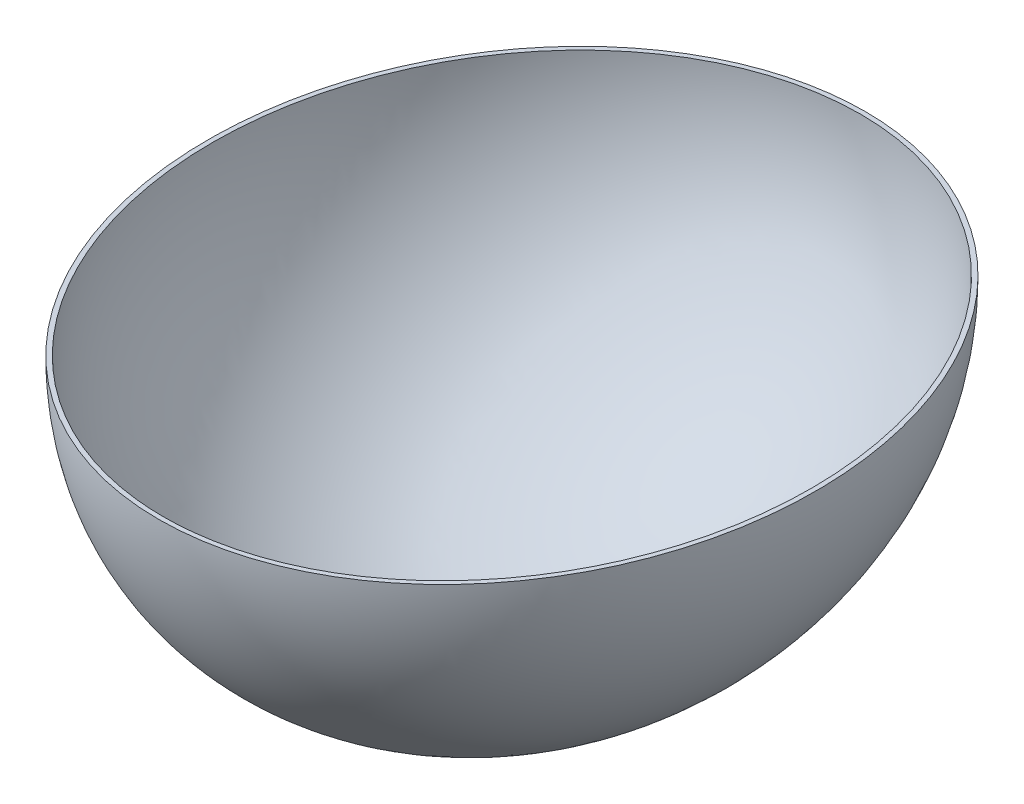
ISO-10303-21;
HEADER;
FILE_DESCRIPTION(('STEP AP214'),'2;1');
FILE_NAME('part.step','',(''),(''),'','','');
FILE_SCHEMA(('AUTOMOTIVE_DESIGN { 1 0 10303 214 1 1 1 1 }'));
ENDSEC;
DATA;
#1=APPLICATION_CONTEXT('core data for automotive mechanical design processes');
#2=APPLICATION_PROTOCOL_DEFINITION('international standard','automotive_design',2000,#1);
#3=PRODUCT_CONTEXT('',#1,'mechanical');
#4=PRODUCT('Part','Part','',(#3));
#5=PRODUCT_RELATED_PRODUCT_CATEGORY('part','',(#4));
#6=PRODUCT_DEFINITION_FORMATION('','',#4);
#7=PRODUCT_DEFINITION_CONTEXT('part definition',#1,'design');
#8=PRODUCT_DEFINITION('design','',#6,#7);
#9=PRODUCT_DEFINITION_SHAPE('','',#8);
#10=(LENGTH_UNIT() NAMED_UNIT(*) SI_UNIT(.MILLI.,.METRE.));
#11=(NAMED_UNIT(*) PLANE_ANGLE_UNIT() SI_UNIT($,.RADIAN.));
#12=(NAMED_UNIT(*) SI_UNIT($,.STERADIAN.) SOLID_ANGLE_UNIT());
#13=UNCERTAINTY_MEASURE_WITH_UNIT(LENGTH_MEASURE(1.E-05),#10,'distance_accuracy_value','');
#14=(GEOMETRIC_REPRESENTATION_CONTEXT(3) GLOBAL_UNCERTAINTY_ASSIGNED_CONTEXT((#13)) GLOBAL_UNIT_ASSIGNED_CONTEXT((#10,
#11,#12)) REPRESENTATION_CONTEXT('',''));
#15=CARTESIAN_POINT('',(0.,0.,0.));
#16=DIRECTION('',(0.,0.,1.));
#17=DIRECTION('',(1.,0.,0.));
#18=AXIS2_PLACEMENT_3D('',#15,#16,#17);
#19=CARTESIAN_POINT('',(0.,0.,0.));
#20=DIRECTION('',(0.,-1.,0.));
#21=DIRECTION('',(0.,0.,-1.));
#22=AXIS2_PLACEMENT_3D('',#19,#20,#21);
#23=ELLIPSE('',#22,230.,198.);
#24=TRIMMED_CURVE('',#23,(PARAMETER_VALUE(3.14159265358979)),
(PARAMETER_VALUE(6.28318530717959)),.T.,.PARAMETER.);
#25=CARTESIAN_POINT('',(0.,0.,0.));
#26=DIRECTION('',(0.,0.,1.));
#27=AXIS1_PLACEMENT('',#25,#26);
#28=SURFACE_OF_REVOLUTION('',#24,#27);
#29=CARTESIAN_POINT('',(0.,0.,0.));
#30=DIRECTION('',(0.,1.,0.));
#31=DIRECTION('',(0.,0.,-1.));
#32=AXIS2_PLACEMENT_3D('',#29,#30,#31);
#33=ELLIPSE('',#32,230.,198.);
#34=CARTESIAN_POINT('',(0.,0.,229.99999999999));
#35=VERTEX_POINT('',#34);
#36=CARTESIAN_POINT('',(0.,0.,-229.99999999999));
#37=VERTEX_POINT('',#36);
#38=EDGE_CURVE('E50',#35,#37,#33,.T.);
#39=ORIENTED_EDGE('',*,*,#38,.F.);
#40=EDGE_CURVE('E44',#35,#37,#23,.T.);
#41=ORIENTED_EDGE('',*,*,#40,.T.);
#42=EDGE_LOOP('',(#39,#41));
#43=FACE_BOUND('',#42,.T.);
#44=ADVANCED_FACE('F33',(#43),#28,.F.);
#45=CARTESIAN_POINT('',(0.,0.,-227.));
#46=CARTESIAN_POINT('',(-12.7333698471468,0.,-227.));
#47=CARTESIAN_POINT('',(-38.191604545818,2.666905491444E-13,-224.087476047217));
#48=CARTESIAN_POINT('',(-74.9443222437661,5.23333405132711E-13,-211.139596550853));
#49=CARTESIAN_POINT('',(-108.854613663859,7.60127704508686E-13,-190.087807001916));
#50=CARTESIAN_POINT('',(-138.618004700002,9.6796435327545E-13,-161.717808595732));
#51=CARTESIAN_POINT('',(-163.074756003387,1.13874493484445E-12,-127.104792386034));
#52=CARTESIAN_POINT('',(-181.266004736451,1.26577374580794E-12,-87.5749462870693));
#53=CARTESIAN_POINT('',(-192.475755389594,1.344051016245E-12,-44.6529102155037));
#54=CARTESIAN_POINT('',(-196.262122305203,1.37049107510073E-12,0.));
#55=CARTESIAN_POINT('',(-192.475755389594,1.344051016245E-12,44.6529102155037));
#56=CARTESIAN_POINT('',(-181.266004736451,1.26577374580794E-12,87.5749462870693));
#57=CARTESIAN_POINT('',(-163.074756003387,1.13874493484445E-12,127.104792386034));
#58=CARTESIAN_POINT('',(-138.618004700002,9.6796435327545E-13,161.717808595732));
#59=CARTESIAN_POINT('',(-108.854613663859,7.60127704508686E-13,190.087807001916));
#60=CARTESIAN_POINT('',(-74.9443222437661,5.23333405132711E-13,211.139596550853));
#61=CARTESIAN_POINT('',(-38.1916045458181,2.66690549144401E-13,224.087476047217));
#62=CARTESIAN_POINT('',(-12.7333698471468,0.,227.));
#63=CARTESIAN_POINT('',(0.,0.,227.));
#64=B_SPLINE_CURVE_WITH_KNOTS('',3,(#45,#46,#47,#48,#49,#50,#51,#52,#53,#54,#55,#56,#57,#58,#59,
#60,#61,#62,#63),.UNSPECIFIED.,.F.,.F.,(4,1,1,1,1,1,1,1,1,1,1,1,1,1,1,1,4),(-3.14159265358979,
-2.94524311274043,-2.74889357189107,-2.55254403104171,-2.35619449019234,-2.15984494934298,
-1.96349540849362,-1.76714586764426,-1.5707963267949,-1.37444678594553,-1.17809724509617,
-0.981747704246811,-0.785398163397448,-0.589048622548086,-0.392699081698724,-0.196349540849362,
0.),.UNSPECIFIED.);
#65=CARTESIAN_POINT('',(0.,0.,0.));
#66=DIRECTION('',(0.,0.,1.));
#67=AXIS1_PLACEMENT('',#65,#66);
#68=SURFACE_OF_REVOLUTION('',#64,#67);
#69=CARTESIAN_POINT('',(0.,0.,-227.));
#70=CARTESIAN_POINT('',(12.7333698471468,0.,-227.));
#71=CARTESIAN_POINT('',(38.191604545818,0.,-224.087476047217));
#72=CARTESIAN_POINT('',(74.9443222437661,0.,-211.139596550853));
#73=CARTESIAN_POINT('',(108.854613663859,0.,-190.087807001916));
#74=CARTESIAN_POINT('',(138.618004700002,0.,-161.717808595732));
#75=CARTESIAN_POINT('',(163.074756003387,0.,-127.104792386034));
#76=CARTESIAN_POINT('',(181.266004736451,0.,-87.5749462870693));
#77=CARTESIAN_POINT('',(192.475755389594,0.,-44.6529102155037));
#78=CARTESIAN_POINT('',(196.262122305203,0.,0.));
#79=CARTESIAN_POINT('',(192.475755389594,0.,44.6529102155037));
#80=CARTESIAN_POINT('',(181.266004736451,0.,87.5749462870693));
#81=CARTESIAN_POINT('',(163.074756003387,0.,127.104792386034));
#82=CARTESIAN_POINT('',(138.618004700002,0.,161.717808595732));
#83=CARTESIAN_POINT('',(108.854613663859,0.,190.087807001916));
#84=CARTESIAN_POINT('',(74.9443222437661,0.,211.139596550853));
#85=CARTESIAN_POINT('',(38.1916045458181,0.,224.087476047217));
#86=CARTESIAN_POINT('',(12.7333698471468,0.,227.));
#87=CARTESIAN_POINT('',(0.,0.,227.));
#88=B_SPLINE_CURVE_WITH_KNOTS('',3,(#69,#70,#71,#72,#73,#74,#75,#76,#77,#78,#79,#80,#81,#82,#83,
#84,#85,#86,#87),.UNSPECIFIED.,.F.,.F.,(4,1,1,1,1,1,1,1,1,1,1,1,1,1,1,1,4),(-3.14159265358979,
-2.94524311274043,-2.74889357189107,-2.55254403104171,-2.35619449019234,-2.15984494934298,
-1.96349540849362,-1.76714586764426,-1.5707963267949,-1.37444678594553,-1.17809724509617,
-0.981747704246811,-0.785398163397448,-0.589048622548086,-0.392699081698724,-0.196349540849362,
0.),.UNSPECIFIED.);
#89=CARTESIAN_POINT('',(0.,0.,-227.));
#90=VERTEX_POINT('',#89);
#91=CARTESIAN_POINT('',(0.,0.,227.));
#92=VERTEX_POINT('',#91);
#93=EDGE_CURVE('E57',#90,#92,#88,.T.);
#94=ORIENTED_EDGE('',*,*,#93,.F.);
#95=EDGE_CURVE('E11',#90,#92,#64,.T.);
#96=ORIENTED_EDGE('',*,*,#95,.T.);
#97=EDGE_LOOP('',(#94,#96));
#98=FACE_BOUND('',#97,.T.);
#99=ADVANCED_FACE('F35',(#98),#68,.F.);
#100=CARTESIAN_POINT('',(0.,0.,0.));
#101=DIRECTION('',(0.,-1.,0.));
#102=DIRECTION('',(0.,0.,1.));
#103=AXIS2_PLACEMENT_3D('',#100,#101,#102);
#104=PLANE('',#103);
#105=ORIENTED_EDGE('',*,*,#95,.F.);
#106=ORIENTED_EDGE('',*,*,#93,.T.);
#107=EDGE_LOOP('',(#105,#106));
#108=FACE_BOUND('',#107,.T.);
#109=ORIENTED_EDGE('',*,*,#40,.F.);
#110=ORIENTED_EDGE('',*,*,#38,.T.);
#111=EDGE_LOOP('',(#109,#110));
#112=FACE_BOUND('',#111,.T.);
#113=ADVANCED_FACE('F62',(#108,#112),#104,.F.);
#114=CLOSED_SHELL('',(#44,#99,#113));
#115=MANIFOLD_SOLID_BREP('B2',#114);
#116=ADVANCED_BREP_SHAPE_REPRESENTATION('',(#18,#115),#14);
#117=SHAPE_DEFINITION_REPRESENTATION(#9,#116);
ENDSEC;
END-ISO-10303-21;
